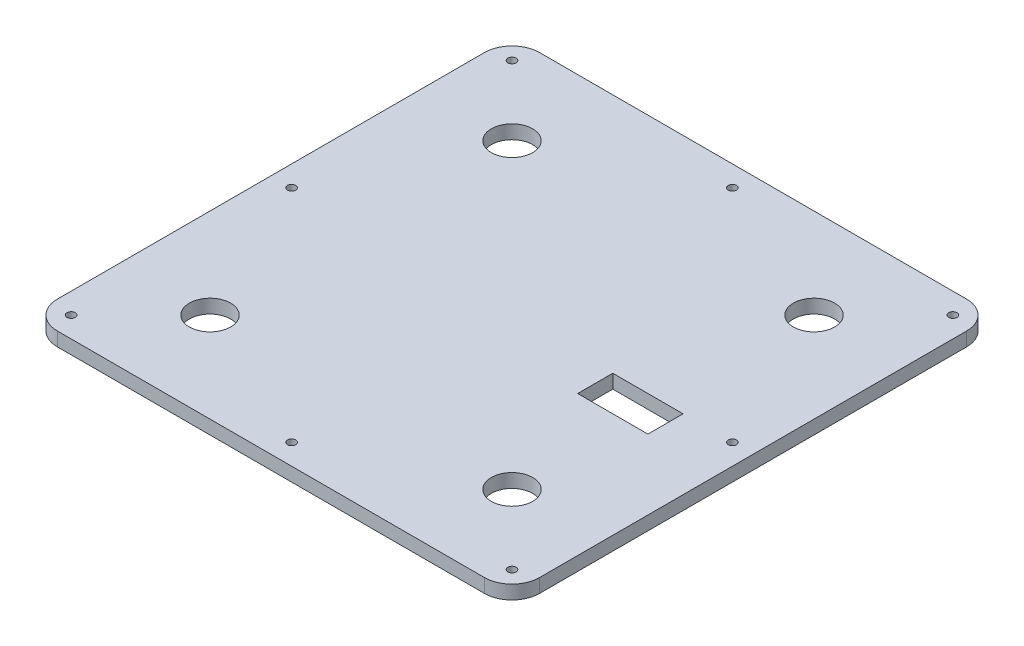
ISO-10303-21;
HEADER;
FILE_DESCRIPTION(('STEP AP214'),'2;1');
FILE_NAME('part.step','',(''),(''),'','','');
FILE_SCHEMA(('AUTOMOTIVE_DESIGN { 1 0 10303 214 1 1 1 1 }'));
ENDSEC;
DATA;
#1=APPLICATION_CONTEXT('core data for automotive mechanical design processes');
#2=APPLICATION_PROTOCOL_DEFINITION('international standard','automotive_design',2000,#1);
#3=PRODUCT_CONTEXT('',#1,'mechanical');
#4=PRODUCT('Part','Part','',(#3));
#5=PRODUCT_RELATED_PRODUCT_CATEGORY('part','',(#4));
#6=PRODUCT_DEFINITION_FORMATION('','',#4);
#7=PRODUCT_DEFINITION_CONTEXT('part definition',#1,'design');
#8=PRODUCT_DEFINITION('design','',#6,#7);
#9=PRODUCT_DEFINITION_SHAPE('','',#8);
#10=(LENGTH_UNIT() NAMED_UNIT(*) SI_UNIT(.MILLI.,.METRE.));
#11=(NAMED_UNIT(*) PLANE_ANGLE_UNIT() SI_UNIT($,.RADIAN.));
#12=(NAMED_UNIT(*) SI_UNIT($,.STERADIAN.) SOLID_ANGLE_UNIT());
#13=UNCERTAINTY_MEASURE_WITH_UNIT(LENGTH_MEASURE(1.E-05),#10,'distance_accuracy_value','');
#14=(GEOMETRIC_REPRESENTATION_CONTEXT(3) GLOBAL_UNCERTAINTY_ASSIGNED_CONTEXT((#13)) GLOBAL_UNIT_ASSIGNED_CONTEXT((#10,
#11,#12)) REPRESENTATION_CONTEXT('',''));
#15=CARTESIAN_POINT('',(0.,0.,0.));
#16=DIRECTION('',(0.,0.,1.));
#17=DIRECTION('',(1.,0.,0.));
#18=AXIS2_PLACEMENT_3D('',#15,#16,#17);
#19=CARTESIAN_POINT('',(-155.,10.,-155.));
#20=DIRECTION('',(0.,1.,0.));
#21=DIRECTION('',(0.,0.,1.));
#22=AXIS2_PLACEMENT_3D('',#19,#20,#21);
#23=PLANE('',#22);
#24=DIRECTION('',(0.,0.,1.));
#25=VECTOR('',#24,1.);
#26=CARTESIAN_POINT('',(73.166512481479,10.,0.));
#27=LINE('',#26,#25);
#28=CARTESIAN_POINT('',(73.166512481479,10.,0.));
#29=VERTEX_POINT('',#28);
#30=CARTESIAN_POINT('',(73.166512481479,10.,25.5));
#31=VERTEX_POINT('',#30);
#32=EDGE_CURVE('E53',#29,#31,#27,.T.);
#33=ORIENTED_EDGE('',*,*,#32,.F.);
#34=DIRECTION('',(-1.,0.,0.));
#35=VECTOR('',#34,1.);
#36=CARTESIAN_POINT('',(73.166512481479,10.,0.));
#37=LINE('',#36,#35);
#38=CARTESIAN_POINT('',(124.166512481479,10.,0.));
#39=VERTEX_POINT('',#38);
#40=EDGE_CURVE('E145',#39,#29,#37,.T.);
#41=ORIENTED_EDGE('',*,*,#40,.F.);
#42=DIRECTION('',(0.,0.,-1.));
#43=VECTOR('',#42,1.);
#44=CARTESIAN_POINT('',(124.166512481479,10.,0.));
#45=LINE('',#44,#43);
#46=CARTESIAN_POINT('',(124.166512481479,10.,25.5));
#47=VERTEX_POINT('',#46);
#48=EDGE_CURVE('E148',#47,#39,#45,.T.);
#49=ORIENTED_EDGE('',*,*,#48,.F.);
#50=DIRECTION('',(1.,0.,0.));
#51=VECTOR('',#50,1.);
#52=CARTESIAN_POINT('',(73.166512481479,10.,25.5));
#53=LINE('',#52,#51);
#54=EDGE_CURVE('E154',#31,#47,#53,.T.);
#55=ORIENTED_EDGE('',*,*,#54,.F.);
#56=EDGE_LOOP('',(#33,#41,#49,#55));
#57=FACE_BOUND('',#56,.T.);
#58=CARTESIAN_POINT('',(160.,10.,-160.));
#59=DIRECTION('',(0.,-1.,0.));
#60=DIRECTION('',(0.,0.,-1.));
#61=AXIS2_PLACEMENT_3D('',#58,#59,#60);
#62=CIRCLE('',#61,3.);
#63=CARTESIAN_POINT('',(160.,10.,-163.));
#64=VERTEX_POINT('',#63);
#65=EDGE_CURVE('E169',#64,#64,#62,.T.);
#66=ORIENTED_EDGE('',*,*,#65,.T.);
#67=EDGE_LOOP('',(#66));
#68=FACE_BOUND('',#67,.T.);
#69=CARTESIAN_POINT('',(160.,10.,0.));
#70=DIRECTION('',(0.,-1.,0.));
#71=DIRECTION('',(0.,0.,-1.));
#72=AXIS2_PLACEMENT_3D('',#69,#70,#71);
#73=CIRCLE('',#72,3.);
#74=CARTESIAN_POINT('',(160.,10.,-3.));
#75=VERTEX_POINT('',#74);
#76=EDGE_CURVE('E178',#75,#75,#73,.T.);
#77=ORIENTED_EDGE('',*,*,#76,.T.);
#78=EDGE_LOOP('',(#77));
#79=FACE_BOUND('',#78,.T.);
#80=CARTESIAN_POINT('',(160.,10.,160.));
#81=DIRECTION('',(0.,-1.,0.));
#82=DIRECTION('',(0.,0.,-1.));
#83=AXIS2_PLACEMENT_3D('',#80,#81,#82);
#84=CIRCLE('',#83,3.);
#85=CARTESIAN_POINT('',(160.,10.,157.));
#86=VERTEX_POINT('',#85);
#87=EDGE_CURVE('E187',#86,#86,#84,.T.);
#88=ORIENTED_EDGE('',*,*,#87,.T.);
#89=EDGE_LOOP('',(#88));
#90=FACE_BOUND('',#89,.T.);
#91=CARTESIAN_POINT('',(0.,10.,160.));
#92=DIRECTION('',(0.,-1.,0.));
#93=DIRECTION('',(0.,0.,-1.));
#94=AXIS2_PLACEMENT_3D('',#91,#92,#93);
#95=CIRCLE('',#94,2.99999999999999);
#96=CARTESIAN_POINT('',(0.,10.,157.));
#97=VERTEX_POINT('',#96);
#98=EDGE_CURVE('E196',#97,#97,#95,.T.);
#99=ORIENTED_EDGE('',*,*,#98,.T.);
#100=EDGE_LOOP('',(#99));
#101=FACE_BOUND('',#100,.T.);
#102=CARTESIAN_POINT('',(-160.,10.,160.));
#103=DIRECTION('',(0.,-1.,0.));
#104=DIRECTION('',(0.,0.,-1.));
#105=AXIS2_PLACEMENT_3D('',#102,#103,#104);
#106=CIRCLE('',#105,3.);
#107=CARTESIAN_POINT('',(-160.,10.,157.));
#108=VERTEX_POINT('',#107);
#109=EDGE_CURVE('E205',#108,#108,#106,.T.);
#110=ORIENTED_EDGE('',*,*,#109,.T.);
#111=EDGE_LOOP('',(#110));
#112=FACE_BOUND('',#111,.T.);
#113=CARTESIAN_POINT('',(-160.,10.,0.));
#114=DIRECTION('',(0.,-1.,0.));
#115=DIRECTION('',(0.,0.,-1.));
#116=AXIS2_PLACEMENT_3D('',#113,#114,#115);
#117=CIRCLE('',#116,3.);
#118=CARTESIAN_POINT('',(-160.,10.,-3.));
#119=VERTEX_POINT('',#118);
#120=EDGE_CURVE('E214',#119,#119,#117,.T.);
#121=ORIENTED_EDGE('',*,*,#120,.T.);
#122=EDGE_LOOP('',(#121));
#123=FACE_BOUND('',#122,.T.);
#124=CARTESIAN_POINT('',(-160.,10.,-160.));
#125=DIRECTION('',(0.,-1.,0.));
#126=DIRECTION('',(0.,0.,-1.));
#127=AXIS2_PLACEMENT_3D('',#124,#125,#126);
#128=CIRCLE('',#127,3.);
#129=CARTESIAN_POINT('',(-160.,10.,-163.));
#130=VERTEX_POINT('',#129);
#131=EDGE_CURVE('E223',#130,#130,#128,.T.);
#132=ORIENTED_EDGE('',*,*,#131,.T.);
#133=EDGE_LOOP('',(#132));
#134=FACE_BOUND('',#133,.T.);
#135=CARTESIAN_POINT('',(0.,10.,-160.));
#136=DIRECTION('',(0.,-1.,0.));
#137=DIRECTION('',(0.,0.,-1.));
#138=AXIS2_PLACEMENT_3D('',#135,#136,#137);
#139=CIRCLE('',#138,2.99999999999999);
#140=CARTESIAN_POINT('',(0.,10.,-163.));
#141=VERTEX_POINT('',#140);
#142=EDGE_CURVE('E232',#141,#141,#139,.T.);
#143=ORIENTED_EDGE('',*,*,#142,.T.);
#144=EDGE_LOOP('',(#143));
#145=FACE_BOUND('',#144,.T.);
#146=CARTESIAN_POINT('',(-109.601551083915,10.,109.601551083915));
#147=DIRECTION('',(0.,1.,0.));
#148=DIRECTION('',(0.,0.,1.));
#149=AXIS2_PLACEMENT_3D('',#146,#147,#148);
#150=CIRCLE('',#149,15.);
#151=CARTESIAN_POINT('',(-109.601551083915,10.,124.601551083915));
#152=VERTEX_POINT('',#151);
#153=EDGE_CURVE('E242',#152,#152,#150,.T.);
#154=ORIENTED_EDGE('',*,*,#153,.F.);
#155=EDGE_LOOP('',(#154));
#156=FACE_BOUND('',#155,.T.);
#157=CARTESIAN_POINT('',(-109.601551083915,10.,-109.601551083915));
#158=DIRECTION('',(0.,1.,0.));
#159=DIRECTION('',(0.,0.,1.));
#160=AXIS2_PLACEMENT_3D('',#157,#158,#159);
#161=CIRCLE('',#160,15.);
#162=CARTESIAN_POINT('',(-109.601551083915,10.,-94.6015510839148));
#163=VERTEX_POINT('',#162);
#164=EDGE_CURVE('E254',#163,#163,#161,.T.);
#165=ORIENTED_EDGE('',*,*,#164,.F.);
#166=EDGE_LOOP('',(#165));
#167=FACE_BOUND('',#166,.T.);
#168=CARTESIAN_POINT('',(-155.,10.,-155.));
#169=DIRECTION('',(0.,1.,0.));
#170=DIRECTION('',(0.,0.,1.));
#171=AXIS2_PLACEMENT_3D('',#168,#169,#170);
#172=CIRCLE('',#171,20.);
#173=CARTESIAN_POINT('',(-155.,10.,-175.));
#174=VERTEX_POINT('',#173);
#175=CARTESIAN_POINT('',(-175.,10.,-155.));
#176=VERTEX_POINT('',#175);
#177=EDGE_CURVE('E260',#174,#176,#172,.T.);
#178=ORIENTED_EDGE('',*,*,#177,.T.);
#179=DIRECTION('',(0.,0.,1.));
#180=VECTOR('',#179,1.);
#181=CARTESIAN_POINT('',(-175.,10.,-155.));
#182=LINE('',#181,#180);
#183=CARTESIAN_POINT('',(-175.,10.,155.));
#184=VERTEX_POINT('',#183);
#185=EDGE_CURVE('E263',#176,#184,#182,.T.);
#186=ORIENTED_EDGE('',*,*,#185,.T.);
#187=CARTESIAN_POINT('',(-155.,10.,155.));
#188=DIRECTION('',(0.,1.,0.));
#189=DIRECTION('',(0.,0.,1.));
#190=AXIS2_PLACEMENT_3D('',#187,#188,#189);
#191=CIRCLE('',#190,20.);
#192=CARTESIAN_POINT('',(-155.,10.,175.));
#193=VERTEX_POINT('',#192);
#194=EDGE_CURVE('E266',#184,#193,#191,.T.);
#195=ORIENTED_EDGE('',*,*,#194,.T.);
#196=DIRECTION('',(1.,0.,0.));
#197=VECTOR('',#196,1.);
#198=CARTESIAN_POINT('',(-155.,10.,175.));
#199=LINE('',#198,#197);
#200=CARTESIAN_POINT('',(155.,10.,175.));
#201=VERTEX_POINT('',#200);
#202=EDGE_CURVE('E268',#193,#201,#199,.T.);
#203=ORIENTED_EDGE('',*,*,#202,.T.);
#204=CARTESIAN_POINT('',(155.,10.,155.));
#205=DIRECTION('',(0.,1.,0.));
#206=DIRECTION('',(0.,0.,1.));
#207=AXIS2_PLACEMENT_3D('',#204,#205,#206);
#208=CIRCLE('',#207,20.);
#209=CARTESIAN_POINT('',(175.,10.,155.));
#210=VERTEX_POINT('',#209);
#211=EDGE_CURVE('E270',#201,#210,#208,.T.);
#212=ORIENTED_EDGE('',*,*,#211,.T.);
#213=DIRECTION('',(0.,0.,-1.));
#214=VECTOR('',#213,1.);
#215=CARTESIAN_POINT('',(175.,10.,-155.));
#216=LINE('',#215,#214);
#217=CARTESIAN_POINT('',(175.,10.,-155.));
#218=VERTEX_POINT('',#217);
#219=EDGE_CURVE('E272',#210,#218,#216,.T.);
#220=ORIENTED_EDGE('',*,*,#219,.T.);
#221=CARTESIAN_POINT('',(155.,10.,-155.));
#222=DIRECTION('',(0.,1.,0.));
#223=DIRECTION('',(0.,0.,-1.));
#224=AXIS2_PLACEMENT_3D('',#221,#222,#223);
#225=CIRCLE('',#224,20.);
#226=CARTESIAN_POINT('',(155.,10.,-175.));
#227=VERTEX_POINT('',#226);
#228=EDGE_CURVE('E274',#218,#227,#225,.T.);
#229=ORIENTED_EDGE('',*,*,#228,.T.);
#230=DIRECTION('',(-1.,0.,0.));
#231=VECTOR('',#230,1.);
#232=CARTESIAN_POINT('',(-155.,10.,-175.));
#233=LINE('',#232,#231);
#234=EDGE_CURVE('E276',#227,#174,#233,.T.);
#235=ORIENTED_EDGE('',*,*,#234,.T.);
#236=EDGE_LOOP('',(#178,#186,#195,#203,#212,#220,#229,#235));
#237=FACE_BOUND('',#236,.T.);
#238=CARTESIAN_POINT('',(109.601551083915,10.,-109.601551083915));
#239=DIRECTION('',(0.,1.,0.));
#240=DIRECTION('',(0.,0.,1.));
#241=AXIS2_PLACEMENT_3D('',#238,#239,#240);
#242=CIRCLE('',#241,15.);
#243=CARTESIAN_POINT('',(109.601551083915,10.,-94.6015510839149));
#244=VERTEX_POINT('',#243);
#245=EDGE_CURVE('E248',#244,#244,#242,.T.);
#246=ORIENTED_EDGE('',*,*,#245,.F.);
#247=EDGE_LOOP('',(#246));
#248=FACE_BOUND('',#247,.T.);
#249=CARTESIAN_POINT('',(109.601551083915,10.,109.601551083915));
#250=DIRECTION('',(0.,1.,0.));
#251=DIRECTION('',(0.,0.,1.));
#252=AXIS2_PLACEMENT_3D('',#249,#250,#251);
#253=CIRCLE('',#252,15.);
#254=CARTESIAN_POINT('',(109.601551083915,10.,124.601551083915));
#255=VERTEX_POINT('',#254);
#256=EDGE_CURVE('E236',#255,#255,#253,.T.);
#257=ORIENTED_EDGE('',*,*,#256,.F.);
#258=EDGE_LOOP('',(#257));
#259=FACE_BOUND('',#258,.T.);
#260=ADVANCED_FACE('F38',(#57,#68,#79,#90,#101,#112,#123,#134,#145,#156,#167,#237,#248,#259),
#23,.T.);
#261=CARTESIAN_POINT('',(-155.,0.,-155.));
#262=DIRECTION('',(0.,1.,0.));
#263=DIRECTION('',(0.,0.,1.));
#264=AXIS2_PLACEMENT_3D('',#261,#262,#263);
#265=PLANE('',#264);
#266=DIRECTION('',(-1.,0.,0.));
#267=VECTOR('',#266,1.);
#268=CARTESIAN_POINT('',(73.166512481479,0.,0.));
#269=LINE('',#268,#267);
#270=CARTESIAN_POINT('',(124.166512481479,0.,0.));
#271=VERTEX_POINT('',#270);
#272=CARTESIAN_POINT('',(73.166512481479,0.,0.));
#273=VERTEX_POINT('',#272);
#274=EDGE_CURVE('E135',#271,#273,#269,.T.);
#275=ORIENTED_EDGE('',*,*,#274,.T.);
#276=DIRECTION('',(0.,0.,1.));
#277=VECTOR('',#276,1.);
#278=CARTESIAN_POINT('',(73.166512481479,0.,0.));
#279=LINE('',#278,#277);
#280=CARTESIAN_POINT('',(73.166512481479,0.,25.5));
#281=VERTEX_POINT('',#280);
#282=EDGE_CURVE('E129',#273,#281,#279,.T.);
#283=ORIENTED_EDGE('',*,*,#282,.T.);
#284=DIRECTION('',(1.,0.,0.));
#285=VECTOR('',#284,1.);
#286=CARTESIAN_POINT('',(73.166512481479,0.,25.5));
#287=LINE('',#286,#285);
#288=CARTESIAN_POINT('',(124.166512481479,0.,25.5));
#289=VERTEX_POINT('',#288);
#290=EDGE_CURVE('E138',#281,#289,#287,.T.);
#291=ORIENTED_EDGE('',*,*,#290,.T.);
#292=DIRECTION('',(0.,0.,-1.));
#293=VECTOR('',#292,1.);
#294=CARTESIAN_POINT('',(124.166512481479,0.,0.));
#295=LINE('',#294,#293);
#296=EDGE_CURVE('E61',#289,#271,#295,.T.);
#297=ORIENTED_EDGE('',*,*,#296,.T.);
#298=EDGE_LOOP('',(#275,#283,#291,#297));
#299=FACE_BOUND('',#298,.T.);
#300=CARTESIAN_POINT('',(160.,0.,-160.));
#301=DIRECTION('',(0.,-1.,0.));
#302=DIRECTION('',(0.,0.,-1.));
#303=AXIS2_PLACEMENT_3D('',#300,#301,#302);
#304=CIRCLE('',#303,6.3);
#305=CARTESIAN_POINT('',(160.,0.,-166.3));
#306=VERTEX_POINT('',#305);
#307=EDGE_CURVE('E160',#306,#306,#304,.T.);
#308=ORIENTED_EDGE('',*,*,#307,.F.);
#309=EDGE_LOOP('',(#308));
#310=FACE_BOUND('',#309,.T.);
#311=CARTESIAN_POINT('',(160.,0.,0.));
#312=DIRECTION('',(0.,-1.,0.));
#313=DIRECTION('',(0.,0.,-1.));
#314=AXIS2_PLACEMENT_3D('',#311,#312,#313);
#315=CIRCLE('',#314,6.3);
#316=CARTESIAN_POINT('',(160.,0.,-6.3));
#317=VERTEX_POINT('',#316);
#318=EDGE_CURVE('E172',#317,#317,#315,.T.);
#319=ORIENTED_EDGE('',*,*,#318,.F.);
#320=EDGE_LOOP('',(#319));
#321=FACE_BOUND('',#320,.T.);
#322=CARTESIAN_POINT('',(160.,0.,160.));
#323=DIRECTION('',(0.,-1.,0.));
#324=DIRECTION('',(0.,0.,-1.));
#325=AXIS2_PLACEMENT_3D('',#322,#323,#324);
#326=CIRCLE('',#325,6.3);
#327=CARTESIAN_POINT('',(160.,0.,153.7));
#328=VERTEX_POINT('',#327);
#329=EDGE_CURVE('E181',#328,#328,#326,.T.);
#330=ORIENTED_EDGE('',*,*,#329,.F.);
#331=EDGE_LOOP('',(#330));
#332=FACE_BOUND('',#331,.T.);
#333=CARTESIAN_POINT('',(0.,0.,160.));
#334=DIRECTION('',(0.,-1.,0.));
#335=DIRECTION('',(0.,0.,-1.));
#336=AXIS2_PLACEMENT_3D('',#333,#334,#335);
#337=CIRCLE('',#336,6.3);
#338=CARTESIAN_POINT('',(0.,0.,153.7));
#339=VERTEX_POINT('',#338);
#340=EDGE_CURVE('E190',#339,#339,#337,.T.);
#341=ORIENTED_EDGE('',*,*,#340,.F.);
#342=EDGE_LOOP('',(#341));
#343=FACE_BOUND('',#342,.T.);
#344=CARTESIAN_POINT('',(-160.,0.,160.));
#345=DIRECTION('',(0.,-1.,0.));
#346=DIRECTION('',(0.,0.,-1.));
#347=AXIS2_PLACEMENT_3D('',#344,#345,#346);
#348=CIRCLE('',#347,6.3);
#349=CARTESIAN_POINT('',(-160.,0.,153.7));
#350=VERTEX_POINT('',#349);
#351=EDGE_CURVE('E199',#350,#350,#348,.T.);
#352=ORIENTED_EDGE('',*,*,#351,.F.);
#353=EDGE_LOOP('',(#352));
#354=FACE_BOUND('',#353,.T.);
#355=CARTESIAN_POINT('',(-160.,0.,0.));
#356=DIRECTION('',(0.,-1.,0.));
#357=DIRECTION('',(0.,0.,-1.));
#358=AXIS2_PLACEMENT_3D('',#355,#356,#357);
#359=CIRCLE('',#358,6.3);
#360=CARTESIAN_POINT('',(-160.,0.,-6.3));
#361=VERTEX_POINT('',#360);
#362=EDGE_CURVE('E208',#361,#361,#359,.T.);
#363=ORIENTED_EDGE('',*,*,#362,.F.);
#364=EDGE_LOOP('',(#363));
#365=FACE_BOUND('',#364,.T.);
#366=CARTESIAN_POINT('',(-160.,0.,-160.));
#367=DIRECTION('',(0.,-1.,0.));
#368=DIRECTION('',(0.,0.,-1.));
#369=AXIS2_PLACEMENT_3D('',#366,#367,#368);
#370=CIRCLE('',#369,6.3);
#371=CARTESIAN_POINT('',(-160.,0.,-166.3));
#372=VERTEX_POINT('',#371);
#373=EDGE_CURVE('E217',#372,#372,#370,.T.);
#374=ORIENTED_EDGE('',*,*,#373,.F.);
#375=EDGE_LOOP('',(#374));
#376=FACE_BOUND('',#375,.T.);
#377=CARTESIAN_POINT('',(0.,0.,-160.));
#378=DIRECTION('',(0.,-1.,0.));
#379=DIRECTION('',(0.,0.,-1.));
#380=AXIS2_PLACEMENT_3D('',#377,#378,#379);
#381=CIRCLE('',#380,6.3);
#382=CARTESIAN_POINT('',(0.,0.,-166.3));
#383=VERTEX_POINT('',#382);
#384=EDGE_CURVE('E226',#383,#383,#381,.T.);
#385=ORIENTED_EDGE('',*,*,#384,.F.);
#386=EDGE_LOOP('',(#385));
#387=FACE_BOUND('',#386,.T.);
#388=CARTESIAN_POINT('',(-155.,0.,-155.));
#389=DIRECTION('',(0.,1.,0.));
#390=DIRECTION('',(0.,0.,1.));
#391=AXIS2_PLACEMENT_3D('',#388,#389,#390);
#392=CIRCLE('',#391,20.);
#393=CARTESIAN_POINT('',(-155.,0.,-175.));
#394=VERTEX_POINT('',#393);
#395=CARTESIAN_POINT('',(-175.,0.,-155.));
#396=VERTEX_POINT('',#395);
#397=EDGE_CURVE('E257',#394,#396,#392,.T.);
#398=ORIENTED_EDGE('',*,*,#397,.F.);
#399=DIRECTION('',(-1.,0.,0.));
#400=VECTOR('',#399,1.);
#401=CARTESIAN_POINT('',(-155.,0.,-175.));
#402=LINE('',#401,#400);
#403=CARTESIAN_POINT('',(155.,0.,-175.));
#404=VERTEX_POINT('',#403);
#405=EDGE_CURVE('E264',#404,#394,#402,.T.);
#406=ORIENTED_EDGE('',*,*,#405,.F.);
#407=CARTESIAN_POINT('',(155.,0.,-155.));
#408=DIRECTION('',(0.,1.,0.));
#409=DIRECTION('',(0.,0.,-1.));
#410=AXIS2_PLACEMENT_3D('',#407,#408,#409);
#411=CIRCLE('',#410,20.);
#412=CARTESIAN_POINT('',(175.,0.,-155.));
#413=VERTEX_POINT('',#412);
#414=EDGE_CURVE('E291',#413,#404,#411,.T.);
#415=ORIENTED_EDGE('',*,*,#414,.F.);
#416=DIRECTION('',(0.,0.,-1.));
#417=VECTOR('',#416,1.);
#418=CARTESIAN_POINT('',(175.,0.,-155.));
#419=LINE('',#418,#417);
#420=CARTESIAN_POINT('',(175.,0.,155.));
#421=VERTEX_POINT('',#420);
#422=EDGE_CURVE('E289',#421,#413,#419,.T.);
#423=ORIENTED_EDGE('',*,*,#422,.F.);
#424=CARTESIAN_POINT('',(155.,0.,155.));
#425=DIRECTION('',(0.,1.,0.));
#426=DIRECTION('',(0.,0.,1.));
#427=AXIS2_PLACEMENT_3D('',#424,#425,#426);
#428=CIRCLE('',#427,20.);
#429=CARTESIAN_POINT('',(155.,0.,175.));
#430=VERTEX_POINT('',#429);
#431=EDGE_CURVE('E287',#430,#421,#428,.T.);
#432=ORIENTED_EDGE('',*,*,#431,.F.);
#433=DIRECTION('',(1.,0.,0.));
#434=VECTOR('',#433,1.);
#435=CARTESIAN_POINT('',(-155.,0.,175.));
#436=LINE('',#435,#434);
#437=CARTESIAN_POINT('',(-155.,0.,175.));
#438=VERTEX_POINT('',#437);
#439=EDGE_CURVE('E285',#438,#430,#436,.T.);
#440=ORIENTED_EDGE('',*,*,#439,.F.);
#441=CARTESIAN_POINT('',(-155.,0.,155.));
#442=DIRECTION('',(0.,1.,0.));
#443=DIRECTION('',(0.,0.,1.));
#444=AXIS2_PLACEMENT_3D('',#441,#442,#443);
#445=CIRCLE('',#444,20.);
#446=CARTESIAN_POINT('',(-175.,0.,155.));
#447=VERTEX_POINT('',#446);
#448=EDGE_CURVE('E283',#447,#438,#445,.T.);
#449=ORIENTED_EDGE('',*,*,#448,.F.);
#450=DIRECTION('',(0.,0.,1.));
#451=VECTOR('',#450,1.);
#452=CARTESIAN_POINT('',(-175.,0.,-155.));
#453=LINE('',#452,#451);
#454=EDGE_CURVE('E281',#396,#447,#453,.T.);
#455=ORIENTED_EDGE('',*,*,#454,.F.);
#456=EDGE_LOOP('',(#398,#406,#415,#423,#432,#440,#449,#455));
#457=FACE_BOUND('',#456,.T.);
#458=CARTESIAN_POINT('',(-109.601551083915,0.,-109.601551083915));
#459=DIRECTION('',(0.,1.,0.));
#460=DIRECTION('',(0.,0.,1.));
#461=AXIS2_PLACEMENT_3D('',#458,#459,#460);
#462=CIRCLE('',#461,15.);
#463=CARTESIAN_POINT('',(-109.601551083915,0.,-94.6015510839148));
#464=VERTEX_POINT('',#463);
#465=EDGE_CURVE('E251',#464,#464,#462,.T.);
#466=ORIENTED_EDGE('',*,*,#465,.T.);
#467=EDGE_LOOP('',(#466));
#468=FACE_BOUND('',#467,.T.);
#469=CARTESIAN_POINT('',(109.601551083915,0.,-109.601551083915));
#470=DIRECTION('',(0.,1.,0.));
#471=DIRECTION('',(0.,0.,1.));
#472=AXIS2_PLACEMENT_3D('',#469,#470,#471);
#473=CIRCLE('',#472,15.);
#474=CARTESIAN_POINT('',(109.601551083915,0.,-94.6015510839149));
#475=VERTEX_POINT('',#474);
#476=EDGE_CURVE('E245',#475,#475,#473,.T.);
#477=ORIENTED_EDGE('',*,*,#476,.T.);
#478=EDGE_LOOP('',(#477));
#479=FACE_BOUND('',#478,.T.);
#480=CARTESIAN_POINT('',(-109.601551083915,0.,109.601551083915));
#481=DIRECTION('',(0.,1.,0.));
#482=DIRECTION('',(0.,0.,1.));
#483=AXIS2_PLACEMENT_3D('',#480,#481,#482);
#484=CIRCLE('',#483,15.);
#485=CARTESIAN_POINT('',(-109.601551083915,0.,124.601551083915));
#486=VERTEX_POINT('',#485);
#487=EDGE_CURVE('E239',#486,#486,#484,.T.);
#488=ORIENTED_EDGE('',*,*,#487,.T.);
#489=EDGE_LOOP('',(#488));
#490=FACE_BOUND('',#489,.T.);
#491=CARTESIAN_POINT('',(109.601551083915,0.,109.601551083915));
#492=DIRECTION('',(0.,1.,0.));
#493=DIRECTION('',(0.,0.,1.));
#494=AXIS2_PLACEMENT_3D('',#491,#492,#493);
#495=CIRCLE('',#494,15.);
#496=CARTESIAN_POINT('',(109.601551083915,0.,124.601551083915));
#497=VERTEX_POINT('',#496);
#498=EDGE_CURVE('E235',#497,#497,#495,.T.);
#499=ORIENTED_EDGE('',*,*,#498,.T.);
#500=EDGE_LOOP('',(#499));
#501=FACE_BOUND('',#500,.T.);
#502=ADVANCED_FACE('F142',(#299,#310,#321,#332,#343,#354,#365,#376,#387,#457,#468,#479,#490,
#501),#265,.F.);
#503=CARTESIAN_POINT('',(-155.,10.,-155.));
#504=DIRECTION('',(0.,-1.,0.));
#505=DIRECTION('',(0.,0.,-1.));
#506=AXIS2_PLACEMENT_3D('',#503,#504,#505);
#507=CYLINDRICAL_SURFACE('',#506,20.);
#508=ORIENTED_EDGE('',*,*,#397,.T.);
#509=DIRECTION('',(0.,-1.,0.));
#510=VECTOR('',#509,1.);
#511=CARTESIAN_POINT('',(-175.,10.,-155.));
#512=LINE('',#511,#510);
#513=EDGE_CURVE('E11',#176,#396,#512,.T.);
#514=ORIENTED_EDGE('',*,*,#513,.F.);
#515=ORIENTED_EDGE('',*,*,#177,.F.);
#516=DIRECTION('',(0.,-1.,0.));
#517=VECTOR('',#516,1.);
#518=CARTESIAN_POINT('',(-155.,10.,-175.));
#519=LINE('',#518,#517);
#520=EDGE_CURVE('E278',#174,#394,#519,.T.);
#521=ORIENTED_EDGE('',*,*,#520,.T.);
#522=EDGE_LOOP('',(#508,#514,#515,#521));
#523=FACE_BOUND('',#522,.T.);
#524=ADVANCED_FACE('F40',(#523),#507,.T.);
#525=CARTESIAN_POINT('',(-175.,10.,-155.));
#526=DIRECTION('',(1.,0.,0.));
#527=DIRECTION('',(0.,0.,-1.));
#528=AXIS2_PLACEMENT_3D('',#525,#526,#527);
#529=PLANE('',#528);
#530=ORIENTED_EDGE('',*,*,#454,.T.);
#531=DIRECTION('',(0.,-1.,0.));
#532=VECTOR('',#531,1.);
#533=CARTESIAN_POINT('',(-175.,10.,155.));
#534=LINE('',#533,#532);
#535=EDGE_CURVE('E46',#184,#447,#534,.T.);
#536=ORIENTED_EDGE('',*,*,#535,.F.);
#537=ORIENTED_EDGE('',*,*,#185,.F.);
#538=ORIENTED_EDGE('',*,*,#513,.T.);
#539=EDGE_LOOP('',(#530,#536,#537,#538));
#540=FACE_BOUND('',#539,.T.);
#541=ADVANCED_FACE('F338',(#540),#529,.F.);
#542=CARTESIAN_POINT('',(-155.,10.,155.));
#543=DIRECTION('',(0.,-1.,0.));
#544=DIRECTION('',(0.,0.,-1.));
#545=AXIS2_PLACEMENT_3D('',#542,#543,#544);
#546=CYLINDRICAL_SURFACE('',#545,20.);
#547=ORIENTED_EDGE('',*,*,#448,.T.);
#548=DIRECTION('',(0.,-1.,0.));
#549=VECTOR('',#548,1.);
#550=CARTESIAN_POINT('',(-155.,10.,175.));
#551=LINE('',#550,#549);
#552=EDGE_CURVE('E308',#193,#438,#551,.T.);
#553=ORIENTED_EDGE('',*,*,#552,.F.);
#554=ORIENTED_EDGE('',*,*,#194,.F.);
#555=ORIENTED_EDGE('',*,*,#535,.T.);
#556=EDGE_LOOP('',(#547,#553,#554,#555));
#557=FACE_BOUND('',#556,.T.);
#558=ADVANCED_FACE('F315',(#557),#546,.T.);
#559=CARTESIAN_POINT('',(-155.,10.,175.));
#560=DIRECTION('',(0.,0.,-1.));
#561=DIRECTION('',(-1.,0.,0.));
#562=AXIS2_PLACEMENT_3D('',#559,#560,#561);
#563=PLANE('',#562);
#564=ORIENTED_EDGE('',*,*,#439,.T.);
#565=DIRECTION('',(0.,-1.,0.));
#566=VECTOR('',#565,1.);
#567=CARTESIAN_POINT('',(155.,10.,175.));
#568=LINE('',#567,#566);
#569=EDGE_CURVE('E305',#201,#430,#568,.T.);
#570=ORIENTED_EDGE('',*,*,#569,.F.);
#571=ORIENTED_EDGE('',*,*,#202,.F.);
#572=ORIENTED_EDGE('',*,*,#552,.T.);
#573=EDGE_LOOP('',(#564,#570,#571,#572));
#574=FACE_BOUND('',#573,.T.);
#575=ADVANCED_FACE('F326',(#574),#563,.F.);
#576=CARTESIAN_POINT('',(155.,10.,155.));
#577=DIRECTION('',(0.,-1.,0.));
#578=DIRECTION('',(0.,0.,-1.));
#579=AXIS2_PLACEMENT_3D('',#576,#577,#578);
#580=CYLINDRICAL_SURFACE('',#579,20.);
#581=ORIENTED_EDGE('',*,*,#431,.T.);
#582=DIRECTION('',(0.,-1.,0.));
#583=VECTOR('',#582,1.);
#584=CARTESIAN_POINT('',(175.,10.,155.));
#585=LINE('',#584,#583);
#586=EDGE_CURVE('E302',#210,#421,#585,.T.);
#587=ORIENTED_EDGE('',*,*,#586,.F.);
#588=ORIENTED_EDGE('',*,*,#211,.F.);
#589=ORIENTED_EDGE('',*,*,#569,.T.);
#590=EDGE_LOOP('',(#581,#587,#588,#589));
#591=FACE_BOUND('',#590,.T.);
#592=ADVANCED_FACE('F330',(#591),#580,.T.);
#593=CARTESIAN_POINT('',(175.,10.,-155.));
#594=DIRECTION('',(-1.,0.,0.));
#595=DIRECTION('',(0.,0.,1.));
#596=AXIS2_PLACEMENT_3D('',#593,#594,#595);
#597=PLANE('',#596);
#598=ORIENTED_EDGE('',*,*,#422,.T.);
#599=DIRECTION('',(0.,-1.,0.));
#600=VECTOR('',#599,1.);
#601=CARTESIAN_POINT('',(175.,10.,-155.));
#602=LINE('',#601,#600);
#603=EDGE_CURVE('E299',#218,#413,#602,.T.);
#604=ORIENTED_EDGE('',*,*,#603,.F.);
#605=ORIENTED_EDGE('',*,*,#219,.F.);
#606=ORIENTED_EDGE('',*,*,#586,.T.);
#607=EDGE_LOOP('',(#598,#604,#605,#606));
#608=FACE_BOUND('',#607,.T.);
#609=ADVANCED_FACE('F351',(#608),#597,.F.);
#610=CARTESIAN_POINT('',(155.,10.,-155.));
#611=DIRECTION('',(0.,-1.,0.));
#612=DIRECTION('',(0.,0.,-1.));
#613=AXIS2_PLACEMENT_3D('',#610,#611,#612);
#614=CYLINDRICAL_SURFACE('',#613,20.);
#615=ORIENTED_EDGE('',*,*,#414,.T.);
#616=DIRECTION('',(0.,-1.,0.));
#617=VECTOR('',#616,1.);
#618=CARTESIAN_POINT('',(155.,10.,-175.));
#619=LINE('',#618,#617);
#620=EDGE_CURVE('E296',#227,#404,#619,.T.);
#621=ORIENTED_EDGE('',*,*,#620,.F.);
#622=ORIENTED_EDGE('',*,*,#228,.F.);
#623=ORIENTED_EDGE('',*,*,#603,.T.);
#624=EDGE_LOOP('',(#615,#621,#622,#623));
#625=FACE_BOUND('',#624,.T.);
#626=ADVANCED_FACE('F349',(#625),#614,.T.);
#627=CARTESIAN_POINT('',(-155.,10.,-175.));
#628=DIRECTION('',(0.,0.,1.));
#629=DIRECTION('',(1.,0.,0.));
#630=AXIS2_PLACEMENT_3D('',#627,#628,#629);
#631=PLANE('',#630);
#632=ORIENTED_EDGE('',*,*,#405,.T.);
#633=ORIENTED_EDGE('',*,*,#520,.F.);
#634=ORIENTED_EDGE('',*,*,#234,.F.);
#635=ORIENTED_EDGE('',*,*,#620,.T.);
#636=EDGE_LOOP('',(#632,#633,#634,#635));
#637=FACE_BOUND('',#636,.T.);
#638=ADVANCED_FACE('F344',(#637),#631,.F.);
#639=CARTESIAN_POINT('',(-109.601551083915,10.,-109.601551083915));
#640=DIRECTION('',(0.,-1.,0.));
#641=DIRECTION('',(0.,0.,-1.));
#642=AXIS2_PLACEMENT_3D('',#639,#640,#641);
#643=CYLINDRICAL_SURFACE('',#642,15.);
#644=ORIENTED_EDGE('',*,*,#164,.T.);
#645=EDGE_LOOP('',(#644));
#646=FACE_BOUND('',#645,.T.);
#647=ORIENTED_EDGE('',*,*,#465,.F.);
#648=EDGE_LOOP('',(#647));
#649=FACE_BOUND('',#648,.T.);
#650=ADVANCED_FACE('F369',(#646,#649),#643,.F.);
#651=CARTESIAN_POINT('',(109.601551083915,10.,-109.601551083915));
#652=DIRECTION('',(0.,-1.,0.));
#653=DIRECTION('',(0.,0.,-1.));
#654=AXIS2_PLACEMENT_3D('',#651,#652,#653);
#655=CYLINDRICAL_SURFACE('',#654,15.);
#656=ORIENTED_EDGE('',*,*,#245,.T.);
#657=EDGE_LOOP('',(#656));
#658=FACE_BOUND('',#657,.T.);
#659=ORIENTED_EDGE('',*,*,#476,.F.);
#660=EDGE_LOOP('',(#659));
#661=FACE_BOUND('',#660,.T.);
#662=ADVANCED_FACE('F376',(#658,#661),#655,.F.);
#663=CARTESIAN_POINT('',(-109.601551083915,10.,109.601551083915));
#664=DIRECTION('',(0.,-1.,0.));
#665=DIRECTION('',(0.,0.,-1.));
#666=AXIS2_PLACEMENT_3D('',#663,#664,#665);
#667=CYLINDRICAL_SURFACE('',#666,15.);
#668=ORIENTED_EDGE('',*,*,#153,.T.);
#669=EDGE_LOOP('',(#668));
#670=FACE_BOUND('',#669,.T.);
#671=ORIENTED_EDGE('',*,*,#487,.F.);
#672=EDGE_LOOP('',(#671));
#673=FACE_BOUND('',#672,.T.);
#674=ADVANCED_FACE('F381',(#670,#673),#667,.F.);
#675=CARTESIAN_POINT('',(109.601551083915,10.,109.601551083915));
#676=DIRECTION('',(0.,-1.,0.));
#677=DIRECTION('',(0.,0.,-1.));
#678=AXIS2_PLACEMENT_3D('',#675,#676,#677);
#679=CYLINDRICAL_SURFACE('',#678,15.);
#680=ORIENTED_EDGE('',*,*,#256,.T.);
#681=EDGE_LOOP('',(#680));
#682=FACE_BOUND('',#681,.T.);
#683=ORIENTED_EDGE('',*,*,#498,.F.);
#684=EDGE_LOOP('',(#683));
#685=FACE_BOUND('',#684,.T.);
#686=ADVANCED_FACE('F393',(#682,#685),#679,.F.);
#687=CARTESIAN_POINT('',(0.,0.,-160.));
#688=DIRECTION('',(0.,-1.,0.));
#689=DIRECTION('',(0.,0.,-1.));
#690=AXIS2_PLACEMENT_3D('',#687,#688,#689);
#691=CYLINDRICAL_SURFACE('',#690,2.99999999999999);
#692=ORIENTED_EDGE('',*,*,#142,.F.);
#693=EDGE_LOOP('',(#692));
#694=FACE_BOUND('',#693,.T.);
#695=CARTESIAN_POINT('',(0.,3.30000000000001,-160.));
#696=DIRECTION('',(0.,-1.,0.));
#697=DIRECTION('',(0.,0.,-1.));
#698=AXIS2_PLACEMENT_3D('',#695,#696,#697);
#699=CIRCLE('',#698,2.99999999999999);
#700=CARTESIAN_POINT('',(0.,3.30000000000001,-163.));
#701=VERTEX_POINT('',#700);
#702=EDGE_CURVE('E229',#701,#701,#699,.T.);
#703=ORIENTED_EDGE('',*,*,#702,.T.);
#704=EDGE_LOOP('',(#703));
#705=FACE_BOUND('',#704,.T.);
#706=ADVANCED_FACE('F395',(#694,#705),#691,.F.);
#707=CARTESIAN_POINT('',(0.,0.,-160.));
#708=DIRECTION('',(0.,-1.,0.));
#709=DIRECTION('',(0.,0.,-1.));
#710=AXIS2_PLACEMENT_3D('',#707,#708,#709);
#711=CONICAL_SURFACE('',#710,6.3,0.785398163397448);
#712=ORIENTED_EDGE('',*,*,#702,.F.);
#713=EDGE_LOOP('',(#712));
#714=FACE_BOUND('',#713,.T.);
#715=ORIENTED_EDGE('',*,*,#384,.T.);
#716=EDGE_LOOP('',(#715));
#717=FACE_BOUND('',#716,.T.);
#718=ADVANCED_FACE('F402',(#714,#717),#711,.F.);
#719=CARTESIAN_POINT('',(-160.,0.,-160.));
#720=DIRECTION('',(0.,-1.,0.));
#721=DIRECTION('',(0.,0.,-1.));
#722=AXIS2_PLACEMENT_3D('',#719,#720,#721);
#723=CYLINDRICAL_SURFACE('',#722,3.);
#724=ORIENTED_EDGE('',*,*,#131,.F.);
#725=EDGE_LOOP('',(#724));
#726=FACE_BOUND('',#725,.T.);
#727=CARTESIAN_POINT('',(-160.,3.30000000000001,-160.));
#728=DIRECTION('',(0.,-1.,0.));
#729=DIRECTION('',(0.,0.,-1.));
#730=AXIS2_PLACEMENT_3D('',#727,#728,#729);
#731=CIRCLE('',#730,3.);
#732=CARTESIAN_POINT('',(-160.,3.30000000000001,-163.));
#733=VERTEX_POINT('',#732);
#734=EDGE_CURVE('E220',#733,#733,#731,.T.);
#735=ORIENTED_EDGE('',*,*,#734,.T.);
#736=EDGE_LOOP('',(#735));
#737=FACE_BOUND('',#736,.T.);
#738=ADVANCED_FACE('F410',(#726,#737),#723,.F.);
#739=CARTESIAN_POINT('',(-160.,0.,-160.));
#740=DIRECTION('',(0.,-1.,0.));
#741=DIRECTION('',(0.,0.,-1.));
#742=AXIS2_PLACEMENT_3D('',#739,#740,#741);
#743=CONICAL_SURFACE('',#742,6.3,0.785398163397446);
#744=ORIENTED_EDGE('',*,*,#734,.F.);
#745=EDGE_LOOP('',(#744));
#746=FACE_BOUND('',#745,.T.);
#747=ORIENTED_EDGE('',*,*,#373,.T.);
#748=EDGE_LOOP('',(#747));
#749=FACE_BOUND('',#748,.T.);
#750=ADVANCED_FACE('F414',(#746,#749),#743,.F.);
#751=CARTESIAN_POINT('',(-160.,0.,0.));
#752=DIRECTION('',(0.,-1.,0.));
#753=DIRECTION('',(0.,0.,-1.));
#754=AXIS2_PLACEMENT_3D('',#751,#752,#753);
#755=CYLINDRICAL_SURFACE('',#754,3.);
#756=ORIENTED_EDGE('',*,*,#120,.F.);
#757=EDGE_LOOP('',(#756));
#758=FACE_BOUND('',#757,.T.);
#759=CARTESIAN_POINT('',(-160.,3.30000000000001,0.));
#760=DIRECTION('',(0.,-1.,0.));
#761=DIRECTION('',(0.,0.,-1.));
#762=AXIS2_PLACEMENT_3D('',#759,#760,#761);
#763=CIRCLE('',#762,3.);
#764=CARTESIAN_POINT('',(-160.,3.30000000000001,-3.));
#765=VERTEX_POINT('',#764);
#766=EDGE_CURVE('E211',#765,#765,#763,.T.);
#767=ORIENTED_EDGE('',*,*,#766,.T.);
#768=EDGE_LOOP('',(#767));
#769=FACE_BOUND('',#768,.T.);
#770=ADVANCED_FACE('F418',(#758,#769),#755,.F.);
#771=CARTESIAN_POINT('',(-160.,0.,0.));
#772=DIRECTION('',(0.,-1.,0.));
#773=DIRECTION('',(0.,0.,-1.));
#774=AXIS2_PLACEMENT_3D('',#771,#772,#773);
#775=CONICAL_SURFACE('',#774,6.3,0.785398163397446);
#776=ORIENTED_EDGE('',*,*,#766,.F.);
#777=EDGE_LOOP('',(#776));
#778=FACE_BOUND('',#777,.T.);
#779=ORIENTED_EDGE('',*,*,#362,.T.);
#780=EDGE_LOOP('',(#779));
#781=FACE_BOUND('',#780,.T.);
#782=ADVANCED_FACE('F422',(#778,#781),#775,.F.);
#783=CARTESIAN_POINT('',(-160.,0.,160.));
#784=DIRECTION('',(0.,-1.,0.));
#785=DIRECTION('',(0.,0.,-1.));
#786=AXIS2_PLACEMENT_3D('',#783,#784,#785);
#787=CYLINDRICAL_SURFACE('',#786,3.);
#788=ORIENTED_EDGE('',*,*,#109,.F.);
#789=EDGE_LOOP('',(#788));
#790=FACE_BOUND('',#789,.T.);
#791=CARTESIAN_POINT('',(-160.,3.30000000000001,160.));
#792=DIRECTION('',(0.,-1.,0.));
#793=DIRECTION('',(0.,0.,-1.));
#794=AXIS2_PLACEMENT_3D('',#791,#792,#793);
#795=CIRCLE('',#794,3.);
#796=CARTESIAN_POINT('',(-160.,3.30000000000001,157.));
#797=VERTEX_POINT('',#796);
#798=EDGE_CURVE('E202',#797,#797,#795,.T.);
#799=ORIENTED_EDGE('',*,*,#798,.T.);
#800=EDGE_LOOP('',(#799));
#801=FACE_BOUND('',#800,.T.);
#802=ADVANCED_FACE('F426',(#790,#801),#787,.F.);
#803=CARTESIAN_POINT('',(-160.,0.,160.));
#804=DIRECTION('',(0.,-1.,0.));
#805=DIRECTION('',(0.,0.,-1.));
#806=AXIS2_PLACEMENT_3D('',#803,#804,#805);
#807=CONICAL_SURFACE('',#806,6.3,0.785398163397446);
#808=ORIENTED_EDGE('',*,*,#798,.F.);
#809=EDGE_LOOP('',(#808));
#810=FACE_BOUND('',#809,.T.);
#811=ORIENTED_EDGE('',*,*,#351,.T.);
#812=EDGE_LOOP('',(#811));
#813=FACE_BOUND('',#812,.T.);
#814=ADVANCED_FACE('F430',(#810,#813),#807,.F.);
#815=CARTESIAN_POINT('',(0.,0.,160.));
#816=DIRECTION('',(0.,-1.,0.));
#817=DIRECTION('',(0.,0.,-1.));
#818=AXIS2_PLACEMENT_3D('',#815,#816,#817);
#819=CYLINDRICAL_SURFACE('',#818,2.99999999999999);
#820=ORIENTED_EDGE('',*,*,#98,.F.);
#821=EDGE_LOOP('',(#820));
#822=FACE_BOUND('',#821,.T.);
#823=CARTESIAN_POINT('',(0.,3.30000000000001,160.));
#824=DIRECTION('',(0.,-1.,0.));
#825=DIRECTION('',(0.,0.,-1.));
#826=AXIS2_PLACEMENT_3D('',#823,#824,#825);
#827=CIRCLE('',#826,2.99999999999999);
#828=CARTESIAN_POINT('',(0.,3.30000000000001,157.));
#829=VERTEX_POINT('',#828);
#830=EDGE_CURVE('E193',#829,#829,#827,.T.);
#831=ORIENTED_EDGE('',*,*,#830,.T.);
#832=EDGE_LOOP('',(#831));
#833=FACE_BOUND('',#832,.T.);
#834=ADVANCED_FACE('F434',(#822,#833),#819,.F.);
#835=CARTESIAN_POINT('',(0.,0.,160.));
#836=DIRECTION('',(0.,-1.,0.));
#837=DIRECTION('',(0.,0.,-1.));
#838=AXIS2_PLACEMENT_3D('',#835,#836,#837);
#839=CONICAL_SURFACE('',#838,6.3,0.785398163397448);
#840=ORIENTED_EDGE('',*,*,#830,.F.);
#841=EDGE_LOOP('',(#840));
#842=FACE_BOUND('',#841,.T.);
#843=ORIENTED_EDGE('',*,*,#340,.T.);
#844=EDGE_LOOP('',(#843));
#845=FACE_BOUND('',#844,.T.);
#846=ADVANCED_FACE('F438',(#842,#845),#839,.F.);
#847=CARTESIAN_POINT('',(160.,0.,160.));
#848=DIRECTION('',(0.,-1.,0.));
#849=DIRECTION('',(0.,0.,-1.));
#850=AXIS2_PLACEMENT_3D('',#847,#848,#849);
#851=CYLINDRICAL_SURFACE('',#850,3.);
#852=ORIENTED_EDGE('',*,*,#87,.F.);
#853=EDGE_LOOP('',(#852));
#854=FACE_BOUND('',#853,.T.);
#855=CARTESIAN_POINT('',(160.,3.30000000000001,160.));
#856=DIRECTION('',(0.,-1.,0.));
#857=DIRECTION('',(0.,0.,-1.));
#858=AXIS2_PLACEMENT_3D('',#855,#856,#857);
#859=CIRCLE('',#858,3.);
#860=CARTESIAN_POINT('',(160.,3.30000000000001,157.));
#861=VERTEX_POINT('',#860);
#862=EDGE_CURVE('E184',#861,#861,#859,.T.);
#863=ORIENTED_EDGE('',*,*,#862,.T.);
#864=EDGE_LOOP('',(#863));
#865=FACE_BOUND('',#864,.T.);
#866=ADVANCED_FACE('F442',(#854,#865),#851,.F.);
#867=CARTESIAN_POINT('',(160.,0.,160.));
#868=DIRECTION('',(0.,-1.,0.));
#869=DIRECTION('',(0.,0.,-1.));
#870=AXIS2_PLACEMENT_3D('',#867,#868,#869);
#871=CONICAL_SURFACE('',#870,6.3,0.785398163397446);
#872=ORIENTED_EDGE('',*,*,#862,.F.);
#873=EDGE_LOOP('',(#872));
#874=FACE_BOUND('',#873,.T.);
#875=ORIENTED_EDGE('',*,*,#329,.T.);
#876=EDGE_LOOP('',(#875));
#877=FACE_BOUND('',#876,.T.);
#878=ADVANCED_FACE('F446',(#874,#877),#871,.F.);
#879=CARTESIAN_POINT('',(160.,0.,0.));
#880=DIRECTION('',(0.,-1.,0.));
#881=DIRECTION('',(0.,0.,-1.));
#882=AXIS2_PLACEMENT_3D('',#879,#880,#881);
#883=CYLINDRICAL_SURFACE('',#882,3.);
#884=ORIENTED_EDGE('',*,*,#76,.F.);
#885=EDGE_LOOP('',(#884));
#886=FACE_BOUND('',#885,.T.);
#887=CARTESIAN_POINT('',(160.,3.30000000000001,0.));
#888=DIRECTION('',(0.,-1.,0.));
#889=DIRECTION('',(0.,0.,-1.));
#890=AXIS2_PLACEMENT_3D('',#887,#888,#889);
#891=CIRCLE('',#890,3.);
#892=CARTESIAN_POINT('',(160.,3.30000000000001,-3.));
#893=VERTEX_POINT('',#892);
#894=EDGE_CURVE('E175',#893,#893,#891,.T.);
#895=ORIENTED_EDGE('',*,*,#894,.T.);
#896=EDGE_LOOP('',(#895));
#897=FACE_BOUND('',#896,.T.);
#898=ADVANCED_FACE('F450',(#886,#897),#883,.F.);
#899=CARTESIAN_POINT('',(160.,0.,0.));
#900=DIRECTION('',(0.,-1.,0.));
#901=DIRECTION('',(0.,0.,-1.));
#902=AXIS2_PLACEMENT_3D('',#899,#900,#901);
#903=CONICAL_SURFACE('',#902,6.3,0.785398163397446);
#904=ORIENTED_EDGE('',*,*,#894,.F.);
#905=EDGE_LOOP('',(#904));
#906=FACE_BOUND('',#905,.T.);
#907=ORIENTED_EDGE('',*,*,#318,.T.);
#908=EDGE_LOOP('',(#907));
#909=FACE_BOUND('',#908,.T.);
#910=ADVANCED_FACE('F454',(#906,#909),#903,.F.);
#911=CARTESIAN_POINT('',(160.,0.,-160.));
#912=DIRECTION('',(0.,-1.,0.));
#913=DIRECTION('',(0.,0.,-1.));
#914=AXIS2_PLACEMENT_3D('',#911,#912,#913);
#915=CYLINDRICAL_SURFACE('',#914,3.);
#916=ORIENTED_EDGE('',*,*,#65,.F.);
#917=EDGE_LOOP('',(#916));
#918=FACE_BOUND('',#917,.T.);
#919=CARTESIAN_POINT('',(160.,3.30000000000001,-160.));
#920=DIRECTION('',(0.,-1.,0.));
#921=DIRECTION('',(0.,0.,-1.));
#922=AXIS2_PLACEMENT_3D('',#919,#920,#921);
#923=CIRCLE('',#922,3.);
#924=CARTESIAN_POINT('',(160.,3.30000000000001,-163.));
#925=VERTEX_POINT('',#924);
#926=EDGE_CURVE('E166',#925,#925,#923,.T.);
#927=ORIENTED_EDGE('',*,*,#926,.T.);
#928=EDGE_LOOP('',(#927));
#929=FACE_BOUND('',#928,.T.);
#930=ADVANCED_FACE('F458',(#918,#929),#915,.F.);
#931=CARTESIAN_POINT('',(160.,0.,-160.));
#932=DIRECTION('',(0.,-1.,0.));
#933=DIRECTION('',(0.,0.,-1.));
#934=AXIS2_PLACEMENT_3D('',#931,#932,#933);
#935=CONICAL_SURFACE('',#934,6.3,0.785398163397446);
#936=ORIENTED_EDGE('',*,*,#926,.F.);
#937=EDGE_LOOP('',(#936));
#938=FACE_BOUND('',#937,.T.);
#939=ORIENTED_EDGE('',*,*,#307,.T.);
#940=EDGE_LOOP('',(#939));
#941=FACE_BOUND('',#940,.T.);
#942=ADVANCED_FACE('F462',(#938,#941),#935,.F.);
#943=CARTESIAN_POINT('',(73.166512481479,0.,0.));
#944=DIRECTION('',(-1.,0.,0.));
#945=DIRECTION('',(0.,0.,1.));
#946=AXIS2_PLACEMENT_3D('',#943,#944,#945);
#947=PLANE('',#946);
#948=ORIENTED_EDGE('',*,*,#32,.T.);
#949=DIRECTION('',(0.,1.,0.));
#950=VECTOR('',#949,1.);
#951=CARTESIAN_POINT('',(73.166512481479,0.,25.5));
#952=LINE('',#951,#950);
#953=EDGE_CURVE('E125',#281,#31,#952,.T.);
#954=ORIENTED_EDGE('',*,*,#953,.F.);
#955=ORIENTED_EDGE('',*,*,#282,.F.);
#956=DIRECTION('',(0.,1.,0.));
#957=VECTOR('',#956,1.);
#958=CARTESIAN_POINT('',(73.166512481479,0.,0.));
#959=LINE('',#958,#957);
#960=EDGE_CURVE('E158',#273,#29,#959,.T.);
#961=ORIENTED_EDGE('',*,*,#960,.T.);
#962=EDGE_LOOP('',(#948,#954,#955,#961));
#963=FACE_BOUND('',#962,.T.);
#964=ADVANCED_FACE('F127',(#963),#947,.F.);
#965=CARTESIAN_POINT('',(73.166512481479,0.,0.));
#966=DIRECTION('',(0.,0.,-1.));
#967=DIRECTION('',(-1.,0.,0.));
#968=AXIS2_PLACEMENT_3D('',#965,#966,#967);
#969=PLANE('',#968);
#970=ORIENTED_EDGE('',*,*,#40,.T.);
#971=ORIENTED_EDGE('',*,*,#960,.F.);
#972=ORIENTED_EDGE('',*,*,#274,.F.);
#973=DIRECTION('',(0.,1.,0.));
#974=VECTOR('',#973,1.);
#975=CARTESIAN_POINT('',(124.166512481479,0.,0.));
#976=LINE('',#975,#974);
#977=EDGE_CURVE('E161',#271,#39,#976,.T.);
#978=ORIENTED_EDGE('',*,*,#977,.T.);
#979=EDGE_LOOP('',(#970,#971,#972,#978));
#980=FACE_BOUND('',#979,.T.);
#981=ADVANCED_FACE('F469',(#980),#969,.F.);
#982=CARTESIAN_POINT('',(124.166512481479,0.,0.));
#983=DIRECTION('',(1.,0.,0.));
#984=DIRECTION('',(0.,0.,-1.));
#985=AXIS2_PLACEMENT_3D('',#982,#983,#984);
#986=PLANE('',#985);
#987=ORIENTED_EDGE('',*,*,#48,.T.);
#988=ORIENTED_EDGE('',*,*,#977,.F.);
#989=ORIENTED_EDGE('',*,*,#296,.F.);
#990=DIRECTION('',(0.,1.,0.));
#991=VECTOR('',#990,1.);
#992=CARTESIAN_POINT('',(124.166512481479,0.,25.5));
#993=LINE('',#992,#991);
#994=EDGE_CURVE('E134',#289,#47,#993,.T.);
#995=ORIENTED_EDGE('',*,*,#994,.T.);
#996=EDGE_LOOP('',(#987,#988,#989,#995));
#997=FACE_BOUND('',#996,.T.);
#998=ADVANCED_FACE('F472',(#997),#986,.F.);
#999=CARTESIAN_POINT('',(73.166512481479,0.,25.5));
#1000=DIRECTION('',(0.,0.,1.));
#1001=DIRECTION('',(1.,0.,0.));
#1002=AXIS2_PLACEMENT_3D('',#999,#1000,#1001);
#1003=PLANE('',#1002);
#1004=ORIENTED_EDGE('',*,*,#54,.T.);
#1005=ORIENTED_EDGE('',*,*,#994,.F.);
#1006=ORIENTED_EDGE('',*,*,#290,.F.);
#1007=ORIENTED_EDGE('',*,*,#953,.T.);
#1008=EDGE_LOOP('',(#1004,#1005,#1006,#1007));
#1009=FACE_BOUND('',#1008,.T.);
#1010=ADVANCED_FACE('F139',(#1009),#1003,.F.);
#1011=CLOSED_SHELL('',(#260,#502,#524,#541,#558,#575,#592,#609,#626,#638,#650,#662,#674,#686,
#706,#718,#738,#750,#770,#782,#802,#814,#834,#846,#866,#878,#898,#910,#930,#942,#964,#981,#998,#1010));
#1012=MANIFOLD_SOLID_BREP('B2',#1011);
#1013=ADVANCED_BREP_SHAPE_REPRESENTATION('',(#18,#1012),#14);
#1014=SHAPE_DEFINITION_REPRESENTATION(#9,#1013);
ENDSEC;
END-ISO-10303-21;
